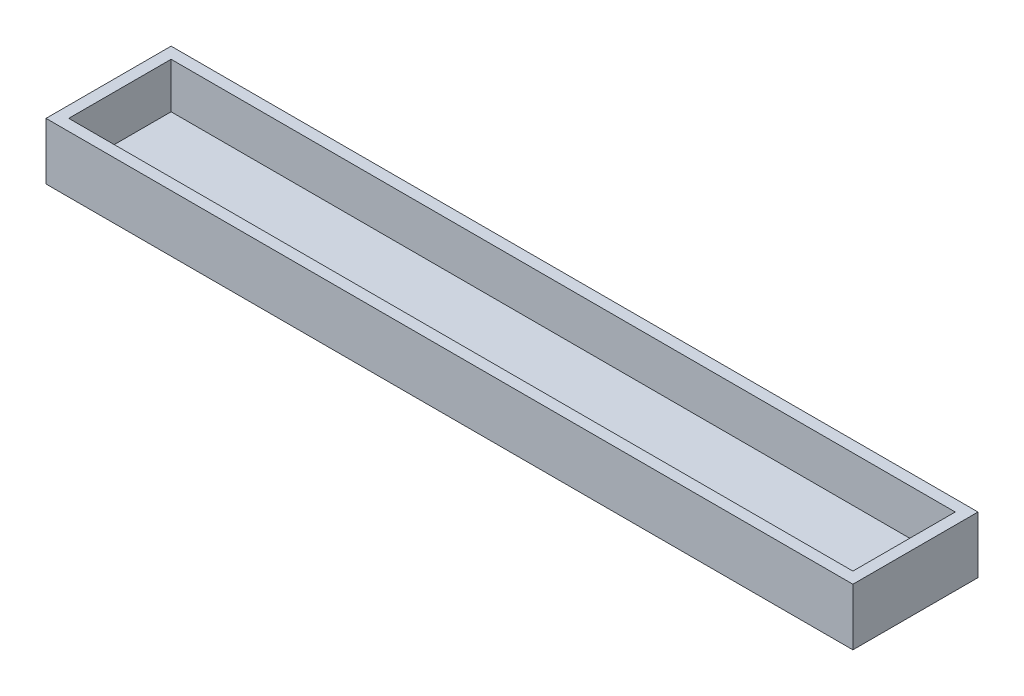
ISO-10303-21;
HEADER;
FILE_DESCRIPTION(('STEP AP214'),'2;1');
FILE_NAME('part.step','',(''),(''),'','','');
FILE_SCHEMA(('AUTOMOTIVE_DESIGN { 1 0 10303 214 1 1 1 1 }'));
ENDSEC;
DATA;
#1=APPLICATION_CONTEXT('core data for automotive mechanical design processes');
#2=APPLICATION_PROTOCOL_DEFINITION('international standard','automotive_design',2000,#1);
#3=PRODUCT_CONTEXT('',#1,'mechanical');
#4=PRODUCT('Part','Part','',(#3));
#5=PRODUCT_RELATED_PRODUCT_CATEGORY('part','',(#4));
#6=PRODUCT_DEFINITION_FORMATION('','',#4);
#7=PRODUCT_DEFINITION_CONTEXT('part definition',#1,'design');
#8=PRODUCT_DEFINITION('design','',#6,#7);
#9=PRODUCT_DEFINITION_SHAPE('','',#8);
#10=(LENGTH_UNIT() NAMED_UNIT(*) SI_UNIT(.MILLI.,.METRE.));
#11=(NAMED_UNIT(*) PLANE_ANGLE_UNIT() SI_UNIT($,.RADIAN.));
#12=(NAMED_UNIT(*) SI_UNIT($,.STERADIAN.) SOLID_ANGLE_UNIT());
#13=UNCERTAINTY_MEASURE_WITH_UNIT(LENGTH_MEASURE(1.E-05),#10,'distance_accuracy_value','');
#14=(GEOMETRIC_REPRESENTATION_CONTEXT(3) GLOBAL_UNCERTAINTY_ASSIGNED_CONTEXT((#13)) GLOBAL_UNIT_ASSIGNED_CONTEXT((#10,
#11,#12)) REPRESENTATION_CONTEXT('',''));
#15=CARTESIAN_POINT('',(0.,0.,0.));
#16=DIRECTION('',(0.,0.,1.));
#17=DIRECTION('',(1.,0.,0.));
#18=AXIS2_PLACEMENT_3D('',#15,#16,#17);
#19=CARTESIAN_POINT('',(354.77,25.,0.));
#20=DIRECTION('',(0.,-1.,0.));
#21=DIRECTION('',(0.,0.,-1.));
#22=AXIS2_PLACEMENT_3D('',#19,#20,#21);
#23=PLANE('',#22);
#24=DIRECTION('',(0.,0.,1.));
#25=VECTOR('',#24,1.);
#26=CARTESIAN_POINT('',(0.,25.,0.));
#27=LINE('',#26,#25);
#28=CARTESIAN_POINT('',(0.,25.,-55.));
#29=VERTEX_POINT('',#28);
#30=CARTESIAN_POINT('',(0.,25.,0.));
#31=VERTEX_POINT('',#30);
#32=EDGE_CURVE('E228',#29,#31,#27,.T.);
#33=ORIENTED_EDGE('',*,*,#32,.T.);
#34=DIRECTION('',(-1.,0.,0.));
#35=VECTOR('',#34,1.);
#36=CARTESIAN_POINT('',(354.77,25.,0.));
#37=LINE('',#36,#35);
#38=CARTESIAN_POINT('',(354.77,25.,0.));
#39=VERTEX_POINT('',#38);
#40=EDGE_CURVE('E237',#39,#31,#37,.T.);
#41=ORIENTED_EDGE('',*,*,#40,.F.);
#42=DIRECTION('',(0.,0.,1.));
#43=VECTOR('',#42,1.);
#44=CARTESIAN_POINT('',(354.77,25.,0.));
#45=LINE('',#44,#43);
#46=CARTESIAN_POINT('',(354.77,25.,-55.));
#47=VERTEX_POINT('',#46);
#48=EDGE_CURVE('E234',#47,#39,#45,.T.);
#49=ORIENTED_EDGE('',*,*,#48,.F.);
#50=DIRECTION('',(-1.,0.,0.));
#51=VECTOR('',#50,1.);
#52=CARTESIAN_POINT('',(354.77,25.,-55.));
#53=LINE('',#52,#51);
#54=EDGE_CURVE('E252',#47,#29,#53,.T.);
#55=ORIENTED_EDGE('',*,*,#54,.T.);
#56=EDGE_LOOP('',(#33,#41,#49,#55));
#57=FACE_BOUND('',#56,.T.);
#58=DIRECTION('',(0.,0.,1.));
#59=VECTOR('',#58,1.);
#60=CARTESIAN_POINT('',(5.,25.,0.));
#61=LINE('',#60,#59);
#62=CARTESIAN_POINT('',(5.,25.,-50.));
#63=VERTEX_POINT('',#62);
#64=CARTESIAN_POINT('',(5.,25.,-5.));
#65=VERTEX_POINT('',#64);
#66=EDGE_CURVE('E192',#63,#65,#61,.T.);
#67=ORIENTED_EDGE('',*,*,#66,.F.);
#68=DIRECTION('',(-1.,0.,0.));
#69=VECTOR('',#68,1.);
#70=CARTESIAN_POINT('',(354.77,25.,-50.));
#71=LINE('',#70,#69);
#72=CARTESIAN_POINT('',(349.77,25.,-50.));
#73=VERTEX_POINT('',#72);
#74=EDGE_CURVE('E199',#73,#63,#71,.T.);
#75=ORIENTED_EDGE('',*,*,#74,.F.);
#76=DIRECTION('',(0.,0.,1.));
#77=VECTOR('',#76,1.);
#78=CARTESIAN_POINT('',(349.77,25.,0.));
#79=LINE('',#78,#77);
#80=CARTESIAN_POINT('',(349.77,25.,-5.));
#81=VERTEX_POINT('',#80);
#82=EDGE_CURVE('E210',#73,#81,#79,.T.);
#83=ORIENTED_EDGE('',*,*,#82,.T.);
#84=DIRECTION('',(-1.,0.,0.));
#85=VECTOR('',#84,1.);
#86=CARTESIAN_POINT('',(354.77,25.,-5.));
#87=LINE('',#86,#85);
#88=EDGE_CURVE('E211',#81,#65,#87,.T.);
#89=ORIENTED_EDGE('',*,*,#88,.T.);
#90=EDGE_LOOP('',(#67,#75,#83,#89));
#91=FACE_BOUND('',#90,.T.);
#92=ADVANCED_FACE('F39',(#57,#91),#23,.F.);
#93=CARTESIAN_POINT('',(354.77,0.,0.));
#94=DIRECTION('',(0.,0.,-1.));
#95=DIRECTION('',(-1.,0.,0.));
#96=AXIS2_PLACEMENT_3D('',#93,#94,#95);
#97=PLANE('',#96);
#98=DIRECTION('',(0.,-1.,0.));
#99=VECTOR('',#98,1.);
#100=CARTESIAN_POINT('',(0.,0.,0.));
#101=LINE('',#100,#99);
#102=CARTESIAN_POINT('',(0.,0.,0.));
#103=VERTEX_POINT('',#102);
#104=EDGE_CURVE('E186',#31,#103,#101,.T.);
#105=ORIENTED_EDGE('',*,*,#104,.T.);
#106=DIRECTION('',(-1.,0.,0.));
#107=VECTOR('',#106,1.);
#108=CARTESIAN_POINT('',(354.77,0.,0.));
#109=LINE('',#108,#107);
#110=CARTESIAN_POINT('',(354.77,0.,0.));
#111=VERTEX_POINT('',#110);
#112=EDGE_CURVE('E11',#111,#103,#109,.T.);
#113=ORIENTED_EDGE('',*,*,#112,.F.);
#114=DIRECTION('',(0.,-1.,0.));
#115=VECTOR('',#114,1.);
#116=CARTESIAN_POINT('',(354.77,0.,0.));
#117=LINE('',#116,#115);
#118=EDGE_CURVE('E223',#39,#111,#117,.T.);
#119=ORIENTED_EDGE('',*,*,#118,.F.);
#120=ORIENTED_EDGE('',*,*,#40,.T.);
#121=EDGE_LOOP('',(#105,#113,#119,#120));
#122=FACE_BOUND('',#121,.T.);
#123=ADVANCED_FACE('F41',(#122),#97,.F.);
#124=CARTESIAN_POINT('',(354.77,0.,0.));
#125=DIRECTION('',(0.,1.,0.));
#126=DIRECTION('',(0.,0.,1.));
#127=AXIS2_PLACEMENT_3D('',#124,#125,#126);
#128=PLANE('',#127);
#129=DIRECTION('',(1.,0.,0.));
#130=VECTOR('',#129,1.);
#131=CARTESIAN_POINT('',(349.77,0.,-12.5));
#132=LINE('',#131,#130);
#133=CARTESIAN_POINT('',(345.77,0.,-12.5));
#134=VERTEX_POINT('',#133);
#135=CARTESIAN_POINT('',(349.77,0.,-12.5));
#136=VERTEX_POINT('',#135);
#137=EDGE_CURVE('E142',#134,#136,#132,.T.);
#138=ORIENTED_EDGE('',*,*,#137,.T.);
#139=DIRECTION('',(0.,0.,-1.));
#140=VECTOR('',#139,1.);
#141=CARTESIAN_POINT('',(349.77,0.,-42.5));
#142=LINE('',#141,#140);
#143=CARTESIAN_POINT('',(349.77,0.,-42.5));
#144=VERTEX_POINT('',#143);
#145=EDGE_CURVE('E133',#136,#144,#142,.T.);
#146=ORIENTED_EDGE('',*,*,#145,.T.);
#147=DIRECTION('',(-1.,0.,0.));
#148=VECTOR('',#147,1.);
#149=CARTESIAN_POINT('',(349.77,0.,-42.5));
#150=LINE('',#149,#148);
#151=CARTESIAN_POINT('',(345.77,0.,-42.5));
#152=VERTEX_POINT('',#151);
#153=EDGE_CURVE('E145',#144,#152,#150,.T.);
#154=ORIENTED_EDGE('',*,*,#153,.T.);
#155=DIRECTION('',(0.,0.,1.));
#156=VECTOR('',#155,1.);
#157=CARTESIAN_POINT('',(345.77,0.,-42.5));
#158=LINE('',#157,#156);
#159=EDGE_CURVE('E60',#152,#134,#158,.T.);
#160=ORIENTED_EDGE('',*,*,#159,.T.);
#161=EDGE_LOOP('',(#138,#146,#154,#160));
#162=FACE_BOUND('',#161,.T.);
#163=DIRECTION('',(0.,0.,-1.));
#164=VECTOR('',#163,1.);
#165=CARTESIAN_POINT('',(0.,0.,0.));
#166=LINE('',#165,#164);
#167=CARTESIAN_POINT('',(0.,0.,-55.));
#168=VERTEX_POINT('',#167);
#169=EDGE_CURVE('E241',#103,#168,#166,.T.);
#170=ORIENTED_EDGE('',*,*,#169,.T.);
#171=DIRECTION('',(-1.,0.,0.));
#172=VECTOR('',#171,1.);
#173=CARTESIAN_POINT('',(354.77,0.,-55.));
#174=LINE('',#173,#172);
#175=CARTESIAN_POINT('',(354.77,0.,-55.));
#176=VERTEX_POINT('',#175);
#177=EDGE_CURVE('E48',#176,#168,#174,.T.);
#178=ORIENTED_EDGE('',*,*,#177,.F.);
#179=DIRECTION('',(0.,0.,-1.));
#180=VECTOR('',#179,1.);
#181=CARTESIAN_POINT('',(354.77,0.,0.));
#182=LINE('',#181,#180);
#183=EDGE_CURVE('E227',#111,#176,#182,.T.);
#184=ORIENTED_EDGE('',*,*,#183,.F.);
#185=ORIENTED_EDGE('',*,*,#112,.T.);
#186=EDGE_LOOP('',(#170,#178,#184,#185));
#187=FACE_BOUND('',#186,.T.);
#188=ADVANCED_FACE('F150',(#162,#187),#128,.F.);
#189=CARTESIAN_POINT('',(354.77,0.,-55.));
#190=DIRECTION('',(0.,0.,1.));
#191=DIRECTION('',(1.,0.,0.));
#192=AXIS2_PLACEMENT_3D('',#189,#190,#191);
#193=PLANE('',#192);
#194=DIRECTION('',(0.,1.,0.));
#195=VECTOR('',#194,1.);
#196=CARTESIAN_POINT('',(0.,0.,-55.));
#197=LINE('',#196,#195);
#198=EDGE_CURVE('E244',#168,#29,#197,.T.);
#199=ORIENTED_EDGE('',*,*,#198,.T.);
#200=ORIENTED_EDGE('',*,*,#54,.F.);
#201=DIRECTION('',(0.,1.,0.));
#202=VECTOR('',#201,1.);
#203=CARTESIAN_POINT('',(354.77,0.,-55.));
#204=LINE('',#203,#202);
#205=EDGE_CURVE('E231',#176,#47,#204,.T.);
#206=ORIENTED_EDGE('',*,*,#205,.F.);
#207=ORIENTED_EDGE('',*,*,#177,.T.);
#208=EDGE_LOOP('',(#199,#200,#206,#207));
#209=FACE_BOUND('',#208,.T.);
#210=ADVANCED_FACE('F261',(#209),#193,.F.);
#211=CARTESIAN_POINT('',(354.77,0.,0.));
#212=DIRECTION('',(-1.,0.,0.));
#213=DIRECTION('',(0.,0.,1.));
#214=AXIS2_PLACEMENT_3D('',#211,#212,#213);
#215=PLANE('',#214);
#216=ORIENTED_EDGE('',*,*,#118,.T.);
#217=ORIENTED_EDGE('',*,*,#183,.T.);
#218=ORIENTED_EDGE('',*,*,#205,.T.);
#219=ORIENTED_EDGE('',*,*,#48,.T.);
#220=EDGE_LOOP('',(#216,#217,#218,#219));
#221=FACE_BOUND('',#220,.T.);
#222=ADVANCED_FACE('F275',(#221),#215,.F.);
#223=CARTESIAN_POINT('',(0.,0.,0.));
#224=DIRECTION('',(-1.,0.,0.));
#225=DIRECTION('',(0.,0.,1.));
#226=AXIS2_PLACEMENT_3D('',#223,#224,#225);
#227=PLANE('',#226);
#228=ORIENTED_EDGE('',*,*,#104,.F.);
#229=ORIENTED_EDGE('',*,*,#32,.F.);
#230=ORIENTED_EDGE('',*,*,#198,.F.);
#231=ORIENTED_EDGE('',*,*,#169,.F.);
#232=EDGE_LOOP('',(#228,#229,#230,#231));
#233=FACE_BOUND('',#232,.T.);
#234=ADVANCED_FACE('F266',(#233),#227,.T.);
#235=CARTESIAN_POINT('',(354.77,0.,-5.));
#236=DIRECTION('',(0.,0.,-1.));
#237=DIRECTION('',(-1.,0.,0.));
#238=AXIS2_PLACEMENT_3D('',#235,#236,#237);
#239=PLANE('',#238);
#240=DIRECTION('',(0.,-1.,0.));
#241=VECTOR('',#240,1.);
#242=CARTESIAN_POINT('',(5.,0.,-5.));
#243=LINE('',#242,#241);
#244=CARTESIAN_POINT('',(5.,5.,-5.));
#245=VERTEX_POINT('',#244);
#246=EDGE_CURVE('E172',#65,#245,#243,.T.);
#247=ORIENTED_EDGE('',*,*,#246,.F.);
#248=ORIENTED_EDGE('',*,*,#88,.F.);
#249=DIRECTION('',(0.,-1.,0.));
#250=VECTOR('',#249,1.);
#251=CARTESIAN_POINT('',(349.77,0.,-5.));
#252=LINE('',#251,#250);
#253=CARTESIAN_POINT('',(349.77,5.,-5.));
#254=VERTEX_POINT('',#253);
#255=EDGE_CURVE('E188',#81,#254,#252,.T.);
#256=ORIENTED_EDGE('',*,*,#255,.T.);
#257=DIRECTION('',(-1.,0.,0.));
#258=VECTOR('',#257,1.);
#259=CARTESIAN_POINT('',(354.77,5.,-5.));
#260=LINE('',#259,#258);
#261=EDGE_CURVE('E182',#254,#245,#260,.T.);
#262=ORIENTED_EDGE('',*,*,#261,.T.);
#263=EDGE_LOOP('',(#247,#248,#256,#262));
#264=FACE_BOUND('',#263,.T.);
#265=ADVANCED_FACE('F289',(#264),#239,.T.);
#266=CARTESIAN_POINT('',(354.77,5.,0.));
#267=DIRECTION('',(0.,1.,0.));
#268=DIRECTION('',(0.,0.,1.));
#269=AXIS2_PLACEMENT_3D('',#266,#267,#268);
#270=PLANE('',#269);
#271=DIRECTION('',(-1.,0.,0.));
#272=VECTOR('',#271,1.);
#273=CARTESIAN_POINT('',(349.77,5.,-42.5));
#274=LINE('',#273,#272);
#275=CARTESIAN_POINT('',(349.77,5.,-42.5));
#276=VERTEX_POINT('',#275);
#277=CARTESIAN_POINT('',(345.77,5.,-42.5));
#278=VERTEX_POINT('',#277);
#279=EDGE_CURVE('E164',#276,#278,#274,.T.);
#280=ORIENTED_EDGE('',*,*,#279,.F.);
#281=DIRECTION('',(0.,0.,-1.));
#282=VECTOR('',#281,1.);
#283=CARTESIAN_POINT('',(349.77,5.,0.));
#284=LINE('',#283,#282);
#285=CARTESIAN_POINT('',(349.77,5.,-50.));
#286=VERTEX_POINT('',#285);
#287=EDGE_CURVE('E136',#276,#286,#284,.T.);
#288=ORIENTED_EDGE('',*,*,#287,.T.);
#289=DIRECTION('',(-1.,0.,0.));
#290=VECTOR('',#289,1.);
#291=CARTESIAN_POINT('',(354.77,5.,-50.));
#292=LINE('',#291,#290);
#293=CARTESIAN_POINT('',(5.,5.,-50.));
#294=VERTEX_POINT('',#293);
#295=EDGE_CURVE('E187',#286,#294,#292,.T.);
#296=ORIENTED_EDGE('',*,*,#295,.T.);
#297=DIRECTION('',(0.,0.,-1.));
#298=VECTOR('',#297,1.);
#299=CARTESIAN_POINT('',(5.,5.,0.));
#300=LINE('',#299,#298);
#301=EDGE_CURVE('E181',#245,#294,#300,.T.);
#302=ORIENTED_EDGE('',*,*,#301,.F.);
#303=ORIENTED_EDGE('',*,*,#261,.F.);
#304=CARTESIAN_POINT('',(349.77,5.,-12.5));
#305=VERTEX_POINT('',#304);
#306=EDGE_CURVE('E200',#254,#305,#284,.T.);
#307=ORIENTED_EDGE('',*,*,#306,.T.);
#308=DIRECTION('',(1.,0.,0.));
#309=VECTOR('',#308,1.);
#310=CARTESIAN_POINT('',(349.77,5.,-12.5));
#311=LINE('',#310,#309);
#312=CARTESIAN_POINT('',(345.77,5.,-12.5));
#313=VERTEX_POINT('',#312);
#314=EDGE_CURVE('E154',#313,#305,#311,.T.);
#315=ORIENTED_EDGE('',*,*,#314,.F.);
#316=DIRECTION('',(0.,0.,1.));
#317=VECTOR('',#316,1.);
#318=CARTESIAN_POINT('',(345.77,5.,-42.5));
#319=LINE('',#318,#317);
#320=EDGE_CURVE('E55',#278,#313,#319,.T.);
#321=ORIENTED_EDGE('',*,*,#320,.F.);
#322=EDGE_LOOP('',(#280,#288,#296,#302,#303,#307,#315,#321));
#323=FACE_BOUND('',#322,.T.);
#324=ADVANCED_FACE('F302',(#323),#270,.T.);
#325=CARTESIAN_POINT('',(354.77,0.,-50.));
#326=DIRECTION('',(0.,0.,1.));
#327=DIRECTION('',(1.,0.,0.));
#328=AXIS2_PLACEMENT_3D('',#325,#326,#327);
#329=PLANE('',#328);
#330=DIRECTION('',(0.,1.,0.));
#331=VECTOR('',#330,1.);
#332=CARTESIAN_POINT('',(5.,0.,-50.));
#333=LINE('',#332,#331);
#334=EDGE_CURVE('E195',#294,#63,#333,.T.);
#335=ORIENTED_EDGE('',*,*,#334,.F.);
#336=ORIENTED_EDGE('',*,*,#295,.F.);
#337=DIRECTION('',(0.,1.,0.));
#338=VECTOR('',#337,1.);
#339=CARTESIAN_POINT('',(349.77,0.,-50.));
#340=LINE('',#339,#338);
#341=EDGE_CURVE('E204',#286,#73,#340,.T.);
#342=ORIENTED_EDGE('',*,*,#341,.T.);
#343=ORIENTED_EDGE('',*,*,#74,.T.);
#344=EDGE_LOOP('',(#335,#336,#342,#343));
#345=FACE_BOUND('',#344,.T.);
#346=ADVANCED_FACE('F299',(#345),#329,.T.);
#347=CARTESIAN_POINT('',(349.77,0.,0.));
#348=DIRECTION('',(-1.,0.,0.));
#349=DIRECTION('',(0.,0.,1.));
#350=AXIS2_PLACEMENT_3D('',#347,#348,#349);
#351=PLANE('',#350);
#352=ORIENTED_EDGE('',*,*,#255,.F.);
#353=ORIENTED_EDGE('',*,*,#82,.F.);
#354=ORIENTED_EDGE('',*,*,#341,.F.);
#355=ORIENTED_EDGE('',*,*,#287,.F.);
#356=DIRECTION('',(0.,1.,0.));
#357=VECTOR('',#356,1.);
#358=CARTESIAN_POINT('',(349.77,0.,-42.5));
#359=LINE('',#358,#357);
#360=EDGE_CURVE('E128',#144,#276,#359,.T.);
#361=ORIENTED_EDGE('',*,*,#360,.F.);
#362=ORIENTED_EDGE('',*,*,#145,.F.);
#363=DIRECTION('',(0.,1.,0.));
#364=VECTOR('',#363,1.);
#365=CARTESIAN_POINT('',(349.77,0.,-12.5));
#366=LINE('',#365,#364);
#367=EDGE_CURVE('E169',#136,#305,#366,.T.);
#368=ORIENTED_EDGE('',*,*,#367,.T.);
#369=ORIENTED_EDGE('',*,*,#306,.F.);
#370=EDGE_LOOP('',(#352,#353,#354,#355,#361,#362,#368,#369));
#371=FACE_BOUND('',#370,.T.);
#372=ADVANCED_FACE('F131',(#371),#351,.T.);
#373=CARTESIAN_POINT('',(5.,0.,0.));
#374=DIRECTION('',(-1.,0.,0.));
#375=DIRECTION('',(0.,0.,1.));
#376=AXIS2_PLACEMENT_3D('',#373,#374,#375);
#377=PLANE('',#376);
#378=ORIENTED_EDGE('',*,*,#246,.T.);
#379=ORIENTED_EDGE('',*,*,#301,.T.);
#380=ORIENTED_EDGE('',*,*,#334,.T.);
#381=ORIENTED_EDGE('',*,*,#66,.T.);
#382=EDGE_LOOP('',(#378,#379,#380,#381));
#383=FACE_BOUND('',#382,.T.);
#384=ADVANCED_FACE('F292',(#383),#377,.F.);
#385=CARTESIAN_POINT('',(349.77,0.,-12.5));
#386=DIRECTION('',(0.,0.,1.));
#387=DIRECTION('',(1.,0.,0.));
#388=AXIS2_PLACEMENT_3D('',#385,#386,#387);
#389=PLANE('',#388);
#390=ORIENTED_EDGE('',*,*,#314,.T.);
#391=ORIENTED_EDGE('',*,*,#367,.F.);
#392=ORIENTED_EDGE('',*,*,#137,.F.);
#393=DIRECTION('',(0.,1.,0.));
#394=VECTOR('',#393,1.);
#395=CARTESIAN_POINT('',(345.77,0.,-12.5));
#396=LINE('',#395,#394);
#397=EDGE_CURVE('E173',#134,#313,#396,.T.);
#398=ORIENTED_EDGE('',*,*,#397,.T.);
#399=EDGE_LOOP('',(#390,#391,#392,#398));
#400=FACE_BOUND('',#399,.T.);
#401=ADVANCED_FACE('F295',(#400),#389,.F.);
#402=CARTESIAN_POINT('',(345.77,0.,-42.5));
#403=DIRECTION('',(-1.,0.,0.));
#404=DIRECTION('',(0.,0.,1.));
#405=AXIS2_PLACEMENT_3D('',#402,#403,#404);
#406=PLANE('',#405);
#407=ORIENTED_EDGE('',*,*,#320,.T.);
#408=ORIENTED_EDGE('',*,*,#397,.F.);
#409=ORIENTED_EDGE('',*,*,#159,.F.);
#410=DIRECTION('',(0.,1.,0.));
#411=VECTOR('',#410,1.);
#412=CARTESIAN_POINT('',(345.77,0.,-42.5));
#413=LINE('',#412,#411);
#414=EDGE_CURVE('E141',#152,#278,#413,.T.);
#415=ORIENTED_EDGE('',*,*,#414,.T.);
#416=EDGE_LOOP('',(#407,#408,#409,#415));
#417=FACE_BOUND('',#416,.T.);
#418=ADVANCED_FACE('F312',(#417),#406,.F.);
#419=CARTESIAN_POINT('',(349.77,0.,-42.5));
#420=DIRECTION('',(0.,0.,-1.));
#421=DIRECTION('',(-1.,0.,0.));
#422=AXIS2_PLACEMENT_3D('',#419,#420,#421);
#423=PLANE('',#422);
#424=ORIENTED_EDGE('',*,*,#279,.T.);
#425=ORIENTED_EDGE('',*,*,#414,.F.);
#426=ORIENTED_EDGE('',*,*,#153,.F.);
#427=ORIENTED_EDGE('',*,*,#360,.T.);
#428=EDGE_LOOP('',(#424,#425,#426,#427));
#429=FACE_BOUND('',#428,.T.);
#430=ADVANCED_FACE('F146',(#429),#423,.F.);
#431=CLOSED_SHELL('',(#92,#123,#188,#210,#222,#234,#265,#324,#346,#372,#384,#401,#418,#430));
#432=MANIFOLD_SOLID_BREP('B2',#431);
#433=ADVANCED_BREP_SHAPE_REPRESENTATION('',(#18,#432),#14);
#434=SHAPE_DEFINITION_REPRESENTATION(#9,#433);
ENDSEC;
END-ISO-10303-21;
